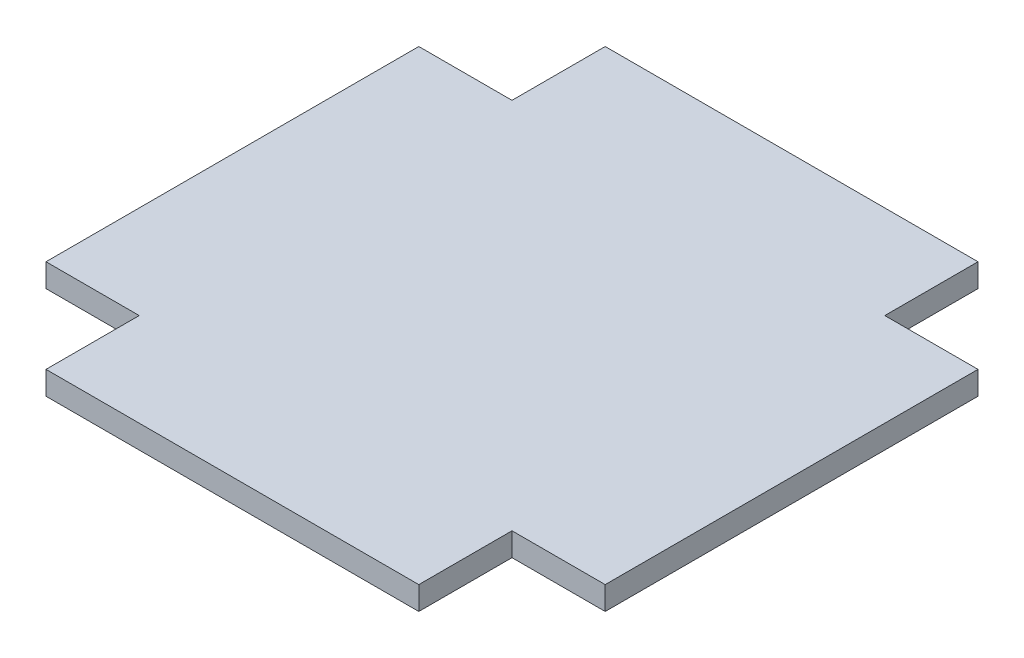
ISO-10303-21;
HEADER;
FILE_DESCRIPTION(('STEP AP214'),'2;1');
FILE_NAME('part.step','',(''),(''),'','','');
FILE_SCHEMA(('AUTOMOTIVE_DESIGN { 1 0 10303 214 1 1 1 1 }'));
ENDSEC;
DATA;
#1=APPLICATION_CONTEXT('core data for automotive mechanical design processes');
#2=APPLICATION_PROTOCOL_DEFINITION('international standard','automotive_design',2000,#1);
#3=PRODUCT_CONTEXT('',#1,'mechanical');
#4=PRODUCT('Part','Part','',(#3));
#5=PRODUCT_RELATED_PRODUCT_CATEGORY('part','',(#4));
#6=PRODUCT_DEFINITION_FORMATION('','',#4);
#7=PRODUCT_DEFINITION_CONTEXT('part definition',#1,'design');
#8=PRODUCT_DEFINITION('design','',#6,#7);
#9=PRODUCT_DEFINITION_SHAPE('','',#8);
#10=(LENGTH_UNIT() NAMED_UNIT(*) SI_UNIT(.MILLI.,.METRE.));
#11=(NAMED_UNIT(*) PLANE_ANGLE_UNIT() SI_UNIT($,.RADIAN.));
#12=(NAMED_UNIT(*) SI_UNIT($,.STERADIAN.) SOLID_ANGLE_UNIT());
#13=UNCERTAINTY_MEASURE_WITH_UNIT(LENGTH_MEASURE(1.E-05),#10,'distance_accuracy_value','');
#14=(GEOMETRIC_REPRESENTATION_CONTEXT(3) GLOBAL_UNCERTAINTY_ASSIGNED_CONTEXT((#13)) GLOBAL_UNIT_ASSIGNED_CONTEXT((#10,
#11,#12)) REPRESENTATION_CONTEXT('',''));
#15=CARTESIAN_POINT('',(0.,0.,0.));
#16=DIRECTION('',(0.,0.,1.));
#17=DIRECTION('',(1.,0.,0.));
#18=AXIS2_PLACEMENT_3D('',#15,#16,#17);
#19=CARTESIAN_POINT('',(-20.,2.5,-30.));
#20=DIRECTION('',(0.,0.,1.));
#21=DIRECTION('',(1.,0.,0.));
#22=AXIS2_PLACEMENT_3D('',#19,#20,#21);
#23=PLANE('',#22);
#24=DIRECTION('',(-1.,0.,0.));
#25=VECTOR('',#24,1.);
#26=CARTESIAN_POINT('',(-20.,0.,-30.));
#27=LINE('',#26,#25);
#28=CARTESIAN_POINT('',(20.,0.,-30.));
#29=VERTEX_POINT('',#28);
#30=CARTESIAN_POINT('',(-20.,0.,-30.));
#31=VERTEX_POINT('',#30);
#32=EDGE_CURVE('E164',#29,#31,#27,.T.);
#33=ORIENTED_EDGE('',*,*,#32,.T.);
#34=DIRECTION('',(0.,-1.,0.));
#35=VECTOR('',#34,1.);
#36=CARTESIAN_POINT('',(-20.,2.5,-30.));
#37=LINE('',#36,#35);
#38=CARTESIAN_POINT('',(-20.,2.5,-30.));
#39=VERTEX_POINT('',#38);
#40=EDGE_CURVE('E11',#39,#31,#37,.T.);
#41=ORIENTED_EDGE('',*,*,#40,.F.);
#42=DIRECTION('',(-1.,0.,0.));
#43=VECTOR('',#42,1.);
#44=CARTESIAN_POINT('',(-20.,2.5,-30.));
#45=LINE('',#44,#43);
#46=CARTESIAN_POINT('',(20.,2.5,-30.));
#47=VERTEX_POINT('',#46);
#48=EDGE_CURVE('E198',#47,#39,#45,.T.);
#49=ORIENTED_EDGE('',*,*,#48,.F.);
#50=DIRECTION('',(0.,-1.,0.));
#51=VECTOR('',#50,1.);
#52=CARTESIAN_POINT('',(20.,2.5,-30.));
#53=LINE('',#52,#51);
#54=EDGE_CURVE('E160',#47,#29,#53,.T.);
#55=ORIENTED_EDGE('',*,*,#54,.T.);
#56=EDGE_LOOP('',(#33,#41,#49,#55));
#57=FACE_BOUND('',#56,.T.);
#58=ADVANCED_FACE('F39',(#57),#23,.F.);
#59=CARTESIAN_POINT('',(-20.,2.5,-30.));
#60=DIRECTION('',(1.,0.,0.));
#61=DIRECTION('',(0.,0.,-1.));
#62=AXIS2_PLACEMENT_3D('',#59,#60,#61);
#63=PLANE('',#62);
#64=DIRECTION('',(0.,0.,1.));
#65=VECTOR('',#64,1.);
#66=CARTESIAN_POINT('',(-20.,0.,-30.));
#67=LINE('',#66,#65);
#68=CARTESIAN_POINT('',(-20.,0.,-20.));
#69=VERTEX_POINT('',#68);
#70=EDGE_CURVE('E168',#31,#69,#67,.T.);
#71=ORIENTED_EDGE('',*,*,#70,.T.);
#72=DIRECTION('',(0.,-1.,0.));
#73=VECTOR('',#72,1.);
#74=CARTESIAN_POINT('',(-20.,2.5,-20.));
#75=LINE('',#74,#73);
#76=CARTESIAN_POINT('',(-20.,2.5,-20.));
#77=VERTEX_POINT('',#76);
#78=EDGE_CURVE('E48',#77,#69,#75,.T.);
#79=ORIENTED_EDGE('',*,*,#78,.F.);
#80=DIRECTION('',(0.,0.,1.));
#81=VECTOR('',#80,1.);
#82=CARTESIAN_POINT('',(-20.,2.5,-30.));
#83=LINE('',#82,#81);
#84=EDGE_CURVE('E111',#39,#77,#83,.T.);
#85=ORIENTED_EDGE('',*,*,#84,.F.);
#86=ORIENTED_EDGE('',*,*,#40,.T.);
#87=EDGE_LOOP('',(#71,#79,#85,#86));
#88=FACE_BOUND('',#87,.T.);
#89=ADVANCED_FACE('F292',(#88),#63,.F.);
#90=CARTESIAN_POINT('',(-20.,2.5,-20.));
#91=DIRECTION('',(0.,0.,1.));
#92=DIRECTION('',(1.,0.,0.));
#93=AXIS2_PLACEMENT_3D('',#90,#91,#92);
#94=PLANE('',#93);
#95=DIRECTION('',(-1.,0.,0.));
#96=VECTOR('',#95,1.);
#97=CARTESIAN_POINT('',(-20.,0.,-20.));
#98=LINE('',#97,#96);
#99=CARTESIAN_POINT('',(-30.,0.,-20.));
#100=VERTEX_POINT('',#99);
#101=EDGE_CURVE('E171',#69,#100,#98,.T.);
#102=ORIENTED_EDGE('',*,*,#101,.T.);
#103=DIRECTION('',(0.,-1.,0.));
#104=VECTOR('',#103,1.);
#105=CARTESIAN_POINT('',(-30.,2.5,-20.));
#106=LINE('',#105,#104);
#107=CARTESIAN_POINT('',(-30.,2.5,-20.));
#108=VERTEX_POINT('',#107);
#109=EDGE_CURVE('E225',#108,#100,#106,.T.);
#110=ORIENTED_EDGE('',*,*,#109,.F.);
#111=DIRECTION('',(-1.,0.,0.));
#112=VECTOR('',#111,1.);
#113=CARTESIAN_POINT('',(-20.,2.5,-20.));
#114=LINE('',#113,#112);
#115=EDGE_CURVE('E235',#77,#108,#114,.T.);
#116=ORIENTED_EDGE('',*,*,#115,.F.);
#117=ORIENTED_EDGE('',*,*,#78,.T.);
#118=EDGE_LOOP('',(#102,#110,#116,#117));
#119=FACE_BOUND('',#118,.T.);
#120=ADVANCED_FACE('F233',(#119),#94,.F.);
#121=CARTESIAN_POINT('',(-30.,2.5,-20.));
#122=DIRECTION('',(1.,0.,0.));
#123=DIRECTION('',(0.,0.,-1.));
#124=AXIS2_PLACEMENT_3D('',#121,#122,#123);
#125=PLANE('',#124);
#126=DIRECTION('',(0.,0.,1.));
#127=VECTOR('',#126,1.);
#128=CARTESIAN_POINT('',(-30.,0.,-20.));
#129=LINE('',#128,#127);
#130=CARTESIAN_POINT('',(-30.,0.,20.));
#131=VERTEX_POINT('',#130);
#132=EDGE_CURVE('E174',#100,#131,#129,.T.);
#133=ORIENTED_EDGE('',*,*,#132,.T.);
#134=DIRECTION('',(0.,-1.,0.));
#135=VECTOR('',#134,1.);
#136=CARTESIAN_POINT('',(-30.,2.5,20.));
#137=LINE('',#136,#135);
#138=CARTESIAN_POINT('',(-30.,2.5,20.));
#139=VERTEX_POINT('',#138);
#140=EDGE_CURVE('E221',#139,#131,#137,.T.);
#141=ORIENTED_EDGE('',*,*,#140,.F.);
#142=DIRECTION('',(0.,0.,1.));
#143=VECTOR('',#142,1.);
#144=CARTESIAN_POINT('',(-30.,2.5,-20.));
#145=LINE('',#144,#143);
#146=EDGE_CURVE('E254',#108,#139,#145,.T.);
#147=ORIENTED_EDGE('',*,*,#146,.F.);
#148=ORIENTED_EDGE('',*,*,#109,.T.);
#149=EDGE_LOOP('',(#133,#141,#147,#148));
#150=FACE_BOUND('',#149,.T.);
#151=ADVANCED_FACE('F244',(#150),#125,.F.);
#152=CARTESIAN_POINT('',(-30.,2.5,20.));
#153=DIRECTION('',(0.,0.,-1.));
#154=DIRECTION('',(-1.,0.,0.));
#155=AXIS2_PLACEMENT_3D('',#152,#153,#154);
#156=PLANE('',#155);
#157=DIRECTION('',(1.,0.,0.));
#158=VECTOR('',#157,1.);
#159=CARTESIAN_POINT('',(-30.,0.,20.));
#160=LINE('',#159,#158);
#161=CARTESIAN_POINT('',(-20.,0.,20.));
#162=VERTEX_POINT('',#161);
#163=EDGE_CURVE('E177',#131,#162,#160,.T.);
#164=ORIENTED_EDGE('',*,*,#163,.T.);
#165=DIRECTION('',(0.,-1.,0.));
#166=VECTOR('',#165,1.);
#167=CARTESIAN_POINT('',(-20.,2.5,20.));
#168=LINE('',#167,#166);
#169=CARTESIAN_POINT('',(-20.,2.5,20.));
#170=VERTEX_POINT('',#169);
#171=EDGE_CURVE('E217',#170,#162,#168,.T.);
#172=ORIENTED_EDGE('',*,*,#171,.F.);
#173=DIRECTION('',(1.,0.,0.));
#174=VECTOR('',#173,1.);
#175=CARTESIAN_POINT('',(-30.,2.5,20.));
#176=LINE('',#175,#174);
#177=EDGE_CURVE('E250',#139,#170,#176,.T.);
#178=ORIENTED_EDGE('',*,*,#177,.F.);
#179=ORIENTED_EDGE('',*,*,#140,.T.);
#180=EDGE_LOOP('',(#164,#172,#178,#179));
#181=FACE_BOUND('',#180,.T.);
#182=ADVANCED_FACE('F248',(#181),#156,.F.);
#183=CARTESIAN_POINT('',(-20.,2.5,20.));
#184=DIRECTION('',(1.,0.,0.));
#185=DIRECTION('',(0.,0.,-1.));
#186=AXIS2_PLACEMENT_3D('',#183,#184,#185);
#187=PLANE('',#186);
#188=DIRECTION('',(0.,0.,1.));
#189=VECTOR('',#188,1.);
#190=CARTESIAN_POINT('',(-20.,0.,20.));
#191=LINE('',#190,#189);
#192=CARTESIAN_POINT('',(-20.,0.,30.));
#193=VERTEX_POINT('',#192);
#194=EDGE_CURVE('E180',#162,#193,#191,.T.);
#195=ORIENTED_EDGE('',*,*,#194,.T.);
#196=DIRECTION('',(0.,-1.,0.));
#197=VECTOR('',#196,1.);
#198=CARTESIAN_POINT('',(-20.,2.5,30.));
#199=LINE('',#198,#197);
#200=CARTESIAN_POINT('',(-20.,2.5,30.));
#201=VERTEX_POINT('',#200);
#202=EDGE_CURVE('E213',#201,#193,#199,.T.);
#203=ORIENTED_EDGE('',*,*,#202,.F.);
#204=DIRECTION('',(0.,0.,1.));
#205=VECTOR('',#204,1.);
#206=CARTESIAN_POINT('',(-20.,2.5,20.));
#207=LINE('',#206,#205);
#208=EDGE_CURVE('E253',#170,#201,#207,.T.);
#209=ORIENTED_EDGE('',*,*,#208,.F.);
#210=ORIENTED_EDGE('',*,*,#171,.T.);
#211=EDGE_LOOP('',(#195,#203,#209,#210));
#212=FACE_BOUND('',#211,.T.);
#213=ADVANCED_FACE('F305',(#212),#187,.F.);
#214=CARTESIAN_POINT('',(-20.,2.5,30.));
#215=DIRECTION('',(0.,0.,-1.));
#216=DIRECTION('',(-1.,0.,0.));
#217=AXIS2_PLACEMENT_3D('',#214,#215,#216);
#218=PLANE('',#217);
#219=DIRECTION('',(1.,0.,0.));
#220=VECTOR('',#219,1.);
#221=CARTESIAN_POINT('',(-20.,0.,30.));
#222=LINE('',#221,#220);
#223=CARTESIAN_POINT('',(20.,0.,30.));
#224=VERTEX_POINT('',#223);
#225=EDGE_CURVE('E183',#193,#224,#222,.T.);
#226=ORIENTED_EDGE('',*,*,#225,.T.);
#227=DIRECTION('',(0.,-1.,0.));
#228=VECTOR('',#227,1.);
#229=CARTESIAN_POINT('',(20.,2.5,30.));
#230=LINE('',#229,#228);
#231=CARTESIAN_POINT('',(20.,2.5,30.));
#232=VERTEX_POINT('',#231);
#233=EDGE_CURVE('E209',#232,#224,#230,.T.);
#234=ORIENTED_EDGE('',*,*,#233,.F.);
#235=DIRECTION('',(1.,0.,0.));
#236=VECTOR('',#235,1.);
#237=CARTESIAN_POINT('',(-20.,2.5,30.));
#238=LINE('',#237,#236);
#239=EDGE_CURVE('E258',#201,#232,#238,.T.);
#240=ORIENTED_EDGE('',*,*,#239,.F.);
#241=ORIENTED_EDGE('',*,*,#202,.T.);
#242=EDGE_LOOP('',(#226,#234,#240,#241));
#243=FACE_BOUND('',#242,.T.);
#244=ADVANCED_FACE('F308',(#243),#218,.F.);
#245=CARTESIAN_POINT('',(20.,2.5,30.));
#246=DIRECTION('',(-1.,0.,0.));
#247=DIRECTION('',(0.,0.,1.));
#248=AXIS2_PLACEMENT_3D('',#245,#246,#247);
#249=PLANE('',#248);
#250=DIRECTION('',(0.,0.,-1.));
#251=VECTOR('',#250,1.);
#252=CARTESIAN_POINT('',(20.,0.,30.));
#253=LINE('',#252,#251);
#254=CARTESIAN_POINT('',(20.,0.,20.));
#255=VERTEX_POINT('',#254);
#256=EDGE_CURVE('E186',#224,#255,#253,.T.);
#257=ORIENTED_EDGE('',*,*,#256,.T.);
#258=DIRECTION('',(0.,-1.,0.));
#259=VECTOR('',#258,1.);
#260=CARTESIAN_POINT('',(20.,2.5,20.));
#261=LINE('',#260,#259);
#262=CARTESIAN_POINT('',(20.,2.5,20.));
#263=VERTEX_POINT('',#262);
#264=EDGE_CURVE('E205',#263,#255,#261,.T.);
#265=ORIENTED_EDGE('',*,*,#264,.F.);
#266=DIRECTION('',(0.,0.,-1.));
#267=VECTOR('',#266,1.);
#268=CARTESIAN_POINT('',(20.,2.5,30.));
#269=LINE('',#268,#267);
#270=EDGE_CURVE('E265',#232,#263,#269,.T.);
#271=ORIENTED_EDGE('',*,*,#270,.F.);
#272=ORIENTED_EDGE('',*,*,#233,.T.);
#273=EDGE_LOOP('',(#257,#265,#271,#272));
#274=FACE_BOUND('',#273,.T.);
#275=ADVANCED_FACE('F273',(#274),#249,.F.);
#276=CARTESIAN_POINT('',(20.,2.5,20.));
#277=DIRECTION('',(0.,0.,-1.));
#278=DIRECTION('',(-1.,0.,0.));
#279=AXIS2_PLACEMENT_3D('',#276,#277,#278);
#280=PLANE('',#279);
#281=DIRECTION('',(1.,0.,0.));
#282=VECTOR('',#281,1.);
#283=CARTESIAN_POINT('',(20.,0.,20.));
#284=LINE('',#283,#282);
#285=CARTESIAN_POINT('',(30.,0.,20.));
#286=VERTEX_POINT('',#285);
#287=EDGE_CURVE('E189',#255,#286,#284,.T.);
#288=ORIENTED_EDGE('',*,*,#287,.T.);
#289=DIRECTION('',(0.,-1.,0.));
#290=VECTOR('',#289,1.);
#291=CARTESIAN_POINT('',(30.,2.5,20.));
#292=LINE('',#291,#290);
#293=CARTESIAN_POINT('',(30.,2.5,20.));
#294=VERTEX_POINT('',#293);
#295=EDGE_CURVE('E153',#294,#286,#292,.T.);
#296=ORIENTED_EDGE('',*,*,#295,.F.);
#297=DIRECTION('',(1.,0.,0.));
#298=VECTOR('',#297,1.);
#299=CARTESIAN_POINT('',(20.,2.5,20.));
#300=LINE('',#299,#298);
#301=EDGE_CURVE('E142',#263,#294,#300,.T.);
#302=ORIENTED_EDGE('',*,*,#301,.F.);
#303=ORIENTED_EDGE('',*,*,#264,.T.);
#304=EDGE_LOOP('',(#288,#296,#302,#303));
#305=FACE_BOUND('',#304,.T.);
#306=ADVANCED_FACE('F277',(#305),#280,.F.);
#307=CARTESIAN_POINT('',(30.,2.5,-20.));
#308=DIRECTION('',(-1.,0.,0.));
#309=DIRECTION('',(0.,0.,1.));
#310=AXIS2_PLACEMENT_3D('',#307,#308,#309);
#311=PLANE('',#310);
#312=DIRECTION('',(0.,0.,-1.));
#313=VECTOR('',#312,1.);
#314=CARTESIAN_POINT('',(30.,0.,-20.));
#315=LINE('',#314,#313);
#316=CARTESIAN_POINT('',(30.,0.,-20.));
#317=VERTEX_POINT('',#316);
#318=EDGE_CURVE('E151',#286,#317,#315,.T.);
#319=ORIENTED_EDGE('',*,*,#318,.T.);
#320=DIRECTION('',(0.,-1.,0.));
#321=VECTOR('',#320,1.);
#322=CARTESIAN_POINT('',(30.,2.5,-20.));
#323=LINE('',#322,#321);
#324=CARTESIAN_POINT('',(30.,2.5,-20.));
#325=VERTEX_POINT('',#324);
#326=EDGE_CURVE('E148',#325,#317,#323,.T.);
#327=ORIENTED_EDGE('',*,*,#326,.F.);
#328=DIRECTION('',(0.,0.,-1.));
#329=VECTOR('',#328,1.);
#330=CARTESIAN_POINT('',(30.,2.5,-20.));
#331=LINE('',#330,#329);
#332=EDGE_CURVE('E136',#294,#325,#331,.T.);
#333=ORIENTED_EDGE('',*,*,#332,.F.);
#334=ORIENTED_EDGE('',*,*,#295,.T.);
#335=EDGE_LOOP('',(#319,#327,#333,#334));
#336=FACE_BOUND('',#335,.T.);
#337=ADVANCED_FACE('F149',(#336),#311,.F.);
#338=CARTESIAN_POINT('',(20.,2.5,-20.));
#339=DIRECTION('',(0.,0.,1.));
#340=DIRECTION('',(1.,0.,0.));
#341=AXIS2_PLACEMENT_3D('',#338,#339,#340);
#342=PLANE('',#341);
#343=DIRECTION('',(-1.,0.,0.));
#344=VECTOR('',#343,1.);
#345=CARTESIAN_POINT('',(20.,0.,-20.));
#346=LINE('',#345,#344);
#347=CARTESIAN_POINT('',(20.,0.,-20.));
#348=VERTEX_POINT('',#347);
#349=EDGE_CURVE('E97',#317,#348,#346,.T.);
#350=ORIENTED_EDGE('',*,*,#349,.T.);
#351=DIRECTION('',(0.,-1.,0.));
#352=VECTOR('',#351,1.);
#353=CARTESIAN_POINT('',(20.,2.5,-20.));
#354=LINE('',#353,#352);
#355=CARTESIAN_POINT('',(20.,2.5,-20.));
#356=VERTEX_POINT('',#355);
#357=EDGE_CURVE('E154',#356,#348,#354,.T.);
#358=ORIENTED_EDGE('',*,*,#357,.F.);
#359=DIRECTION('',(-1.,0.,0.));
#360=VECTOR('',#359,1.);
#361=CARTESIAN_POINT('',(20.,2.5,-20.));
#362=LINE('',#361,#360);
#363=EDGE_CURVE('E140',#325,#356,#362,.T.);
#364=ORIENTED_EDGE('',*,*,#363,.F.);
#365=ORIENTED_EDGE('',*,*,#326,.T.);
#366=EDGE_LOOP('',(#350,#358,#364,#365));
#367=FACE_BOUND('',#366,.T.);
#368=ADVANCED_FACE('F156',(#367),#342,.F.);
#369=CARTESIAN_POINT('',(20.,2.5,-30.));
#370=DIRECTION('',(-1.,0.,0.));
#371=DIRECTION('',(0.,0.,1.));
#372=AXIS2_PLACEMENT_3D('',#369,#370,#371);
#373=PLANE('',#372);
#374=DIRECTION('',(0.,0.,-1.));
#375=VECTOR('',#374,1.);
#376=CARTESIAN_POINT('',(20.,0.,-30.));
#377=LINE('',#376,#375);
#378=EDGE_CURVE('E103',#348,#29,#377,.T.);
#379=ORIENTED_EDGE('',*,*,#378,.T.);
#380=ORIENTED_EDGE('',*,*,#54,.F.);
#381=DIRECTION('',(0.,0.,-1.));
#382=VECTOR('',#381,1.);
#383=CARTESIAN_POINT('',(20.,2.5,-30.));
#384=LINE('',#383,#382);
#385=EDGE_CURVE('E56',#356,#47,#384,.T.);
#386=ORIENTED_EDGE('',*,*,#385,.F.);
#387=ORIENTED_EDGE('',*,*,#357,.T.);
#388=EDGE_LOOP('',(#379,#380,#386,#387));
#389=FACE_BOUND('',#388,.T.);
#390=ADVANCED_FACE('F281',(#389),#373,.F.);
#391=CARTESIAN_POINT('',(0.,2.5,0.));
#392=DIRECTION('',(0.,-1.,0.));
#393=DIRECTION('',(0.,0.,-1.));
#394=AXIS2_PLACEMENT_3D('',#391,#392,#393);
#395=PLANE('',#394);
#396=ORIENTED_EDGE('',*,*,#48,.T.);
#397=ORIENTED_EDGE('',*,*,#84,.T.);
#398=ORIENTED_EDGE('',*,*,#115,.T.);
#399=ORIENTED_EDGE('',*,*,#146,.T.);
#400=ORIENTED_EDGE('',*,*,#177,.T.);
#401=ORIENTED_EDGE('',*,*,#208,.T.);
#402=ORIENTED_EDGE('',*,*,#239,.T.);
#403=ORIENTED_EDGE('',*,*,#270,.T.);
#404=ORIENTED_EDGE('',*,*,#301,.T.);
#405=ORIENTED_EDGE('',*,*,#332,.T.);
#406=ORIENTED_EDGE('',*,*,#363,.T.);
#407=ORIENTED_EDGE('',*,*,#385,.T.);
#408=EDGE_LOOP('',(#396,#397,#398,#399,#400,#401,#402,#403,#404,#405,#406,#407));
#409=FACE_BOUND('',#408,.T.);
#410=ADVANCED_FACE('F138',(#409),#395,.F.);
#411=CARTESIAN_POINT('',(0.,0.,0.));
#412=DIRECTION('',(0.,-1.,0.));
#413=DIRECTION('',(0.,0.,-1.));
#414=AXIS2_PLACEMENT_3D('',#411,#412,#413);
#415=PLANE('',#414);
#416=ORIENTED_EDGE('',*,*,#32,.F.);
#417=ORIENTED_EDGE('',*,*,#378,.F.);
#418=ORIENTED_EDGE('',*,*,#349,.F.);
#419=ORIENTED_EDGE('',*,*,#318,.F.);
#420=ORIENTED_EDGE('',*,*,#287,.F.);
#421=ORIENTED_EDGE('',*,*,#256,.F.);
#422=ORIENTED_EDGE('',*,*,#225,.F.);
#423=ORIENTED_EDGE('',*,*,#194,.F.);
#424=ORIENTED_EDGE('',*,*,#163,.F.);
#425=ORIENTED_EDGE('',*,*,#132,.F.);
#426=ORIENTED_EDGE('',*,*,#101,.F.);
#427=ORIENTED_EDGE('',*,*,#70,.F.);
#428=EDGE_LOOP('',(#416,#417,#418,#419,#420,#421,#422,#423,#424,#425,#426,#427));
#429=FACE_BOUND('',#428,.T.);
#430=ADVANCED_FACE('F239',(#429),#415,.T.);
#431=CLOSED_SHELL('',(#58,#89,#120,#151,#182,#213,#244,#275,#306,#337,#368,#390,#410,#430));
#432=MANIFOLD_SOLID_BREP('B2',#431);
#433=ADVANCED_BREP_SHAPE_REPRESENTATION('',(#18,#432),#14);
#434=SHAPE_DEFINITION_REPRESENTATION(#9,#433);
ENDSEC;
END-ISO-10303-21;
